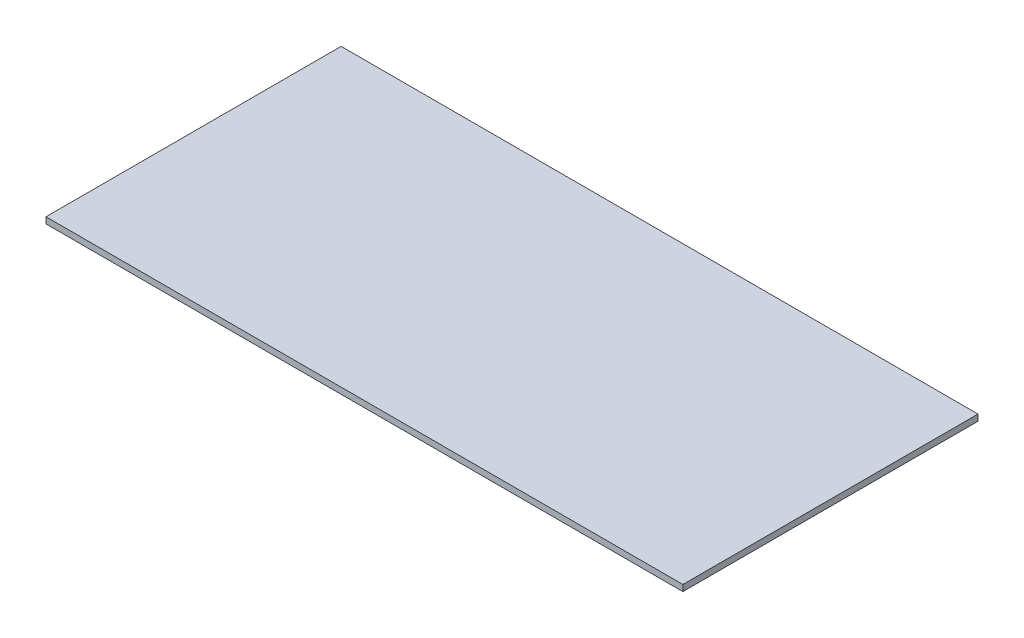
ISO-10303-21;
HEADER;
FILE_DESCRIPTION(('STEP AP214'),'2;1');
FILE_NAME('part.step','',(''),(''),'','','');
FILE_SCHEMA(('AUTOMOTIVE_DESIGN { 1 0 10303 214 1 1 1 1 }'));
ENDSEC;
DATA;
#1=APPLICATION_CONTEXT('core data for automotive mechanical design processes');
#2=APPLICATION_PROTOCOL_DEFINITION('international standard','automotive_design',2000,#1);
#3=PRODUCT_CONTEXT('',#1,'mechanical');
#4=PRODUCT('Part','Part','',(#3));
#5=PRODUCT_RELATED_PRODUCT_CATEGORY('part','',(#4));
#6=PRODUCT_DEFINITION_FORMATION('','',#4);
#7=PRODUCT_DEFINITION_CONTEXT('part definition',#1,'design');
#8=PRODUCT_DEFINITION('design','',#6,#7);
#9=PRODUCT_DEFINITION_SHAPE('','',#8);
#10=(LENGTH_UNIT() NAMED_UNIT(*) SI_UNIT(.MILLI.,.METRE.));
#11=(NAMED_UNIT(*) PLANE_ANGLE_UNIT() SI_UNIT($,.RADIAN.));
#12=(NAMED_UNIT(*) SI_UNIT($,.STERADIAN.) SOLID_ANGLE_UNIT());
#13=UNCERTAINTY_MEASURE_WITH_UNIT(LENGTH_MEASURE(1.E-05),#10,'distance_accuracy_value','');
#14=(GEOMETRIC_REPRESENTATION_CONTEXT(3) GLOBAL_UNCERTAINTY_ASSIGNED_CONTEXT((#13)) GLOBAL_UNIT_ASSIGNED_CONTEXT((#10,
#11,#12)) REPRESENTATION_CONTEXT('',''));
#15=CARTESIAN_POINT('',(0.,0.,0.));
#16=DIRECTION('',(0.,0.,1.));
#17=DIRECTION('',(1.,0.,0.));
#18=AXIS2_PLACEMENT_3D('',#15,#16,#17);
#19=CARTESIAN_POINT('',(205.,4.,-95.));
#20=DIRECTION('',(-1.,0.,0.));
#21=DIRECTION('',(0.,0.,1.));
#22=AXIS2_PLACEMENT_3D('',#19,#20,#21);
#23=PLANE('',#22);
#24=DIRECTION('',(0.,0.,-1.));
#25=VECTOR('',#24,1.);
#26=CARTESIAN_POINT('',(205.,0.,-95.));
#27=LINE('',#26,#25);
#28=CARTESIAN_POINT('',(205.,0.,95.));
#29=VERTEX_POINT('',#28);
#30=CARTESIAN_POINT('',(205.,0.,-95.));
#31=VERTEX_POINT('',#30);
#32=EDGE_CURVE('E108',#29,#31,#27,.T.);
#33=ORIENTED_EDGE('',*,*,#32,.T.);
#34=DIRECTION('',(0.,-1.,0.));
#35=VECTOR('',#34,1.);
#36=CARTESIAN_POINT('',(205.,4.,-95.));
#37=LINE('',#36,#35);
#38=CARTESIAN_POINT('',(205.,4.,-95.));
#39=VERTEX_POINT('',#38);
#40=EDGE_CURVE('E11',#39,#31,#37,.T.);
#41=ORIENTED_EDGE('',*,*,#40,.F.);
#42=DIRECTION('',(0.,0.,-1.));
#43=VECTOR('',#42,1.);
#44=CARTESIAN_POINT('',(205.,4.,-95.));
#45=LINE('',#44,#43);
#46=CARTESIAN_POINT('',(205.,4.,95.));
#47=VERTEX_POINT('',#46);
#48=EDGE_CURVE('E96',#47,#39,#45,.T.);
#49=ORIENTED_EDGE('',*,*,#48,.F.);
#50=DIRECTION('',(0.,-1.,0.));
#51=VECTOR('',#50,1.);
#52=CARTESIAN_POINT('',(205.,4.,95.));
#53=LINE('',#52,#51);
#54=EDGE_CURVE('E104',#47,#29,#53,.T.);
#55=ORIENTED_EDGE('',*,*,#54,.T.);
#56=EDGE_LOOP('',(#33,#41,#49,#55));
#57=FACE_BOUND('',#56,.T.);
#58=ADVANCED_FACE('F45',(#57),#23,.F.);
#59=CARTESIAN_POINT('',(-205.,4.,-95.));
#60=DIRECTION('',(0.,0.,1.));
#61=DIRECTION('',(1.,0.,0.));
#62=AXIS2_PLACEMENT_3D('',#59,#60,#61);
#63=PLANE('',#62);
#64=DIRECTION('',(-1.,0.,0.));
#65=VECTOR('',#64,1.);
#66=CARTESIAN_POINT('',(-205.,0.,-95.));
#67=LINE('',#66,#65);
#68=CARTESIAN_POINT('',(-205.,0.,-95.));
#69=VERTEX_POINT('',#68);
#70=EDGE_CURVE('E100',#31,#69,#67,.T.);
#71=ORIENTED_EDGE('',*,*,#70,.T.);
#72=DIRECTION('',(0.,-1.,0.));
#73=VECTOR('',#72,1.);
#74=CARTESIAN_POINT('',(-205.,4.,-95.));
#75=LINE('',#74,#73);
#76=CARTESIAN_POINT('',(-205.,4.,-95.));
#77=VERTEX_POINT('',#76);
#78=EDGE_CURVE('E53',#77,#69,#75,.T.);
#79=ORIENTED_EDGE('',*,*,#78,.F.);
#80=DIRECTION('',(-1.,0.,0.));
#81=VECTOR('',#80,1.);
#82=CARTESIAN_POINT('',(-205.,4.,-95.));
#83=LINE('',#82,#81);
#84=EDGE_CURVE('E91',#39,#77,#83,.T.);
#85=ORIENTED_EDGE('',*,*,#84,.F.);
#86=ORIENTED_EDGE('',*,*,#40,.T.);
#87=EDGE_LOOP('',(#71,#79,#85,#86));
#88=FACE_BOUND('',#87,.T.);
#89=ADVANCED_FACE('F99',(#88),#63,.F.);
#90=CARTESIAN_POINT('',(-205.,4.,-95.));
#91=DIRECTION('',(1.,0.,0.));
#92=DIRECTION('',(0.,0.,-1.));
#93=AXIS2_PLACEMENT_3D('',#90,#91,#92);
#94=PLANE('',#93);
#95=DIRECTION('',(0.,0.,1.));
#96=VECTOR('',#95,1.);
#97=CARTESIAN_POINT('',(-205.,0.,-95.));
#98=LINE('',#97,#96);
#99=CARTESIAN_POINT('',(-205.,0.,95.));
#100=VERTEX_POINT('',#99);
#101=EDGE_CURVE('E78',#69,#100,#98,.T.);
#102=ORIENTED_EDGE('',*,*,#101,.T.);
#103=DIRECTION('',(0.,-1.,0.));
#104=VECTOR('',#103,1.);
#105=CARTESIAN_POINT('',(-205.,4.,95.));
#106=LINE('',#105,#104);
#107=CARTESIAN_POINT('',(-205.,4.,95.));
#108=VERTEX_POINT('',#107);
#109=EDGE_CURVE('E101',#108,#100,#106,.T.);
#110=ORIENTED_EDGE('',*,*,#109,.F.);
#111=DIRECTION('',(0.,0.,1.));
#112=VECTOR('',#111,1.);
#113=CARTESIAN_POINT('',(-205.,4.,-95.));
#114=LINE('',#113,#112);
#115=EDGE_CURVE('E94',#77,#108,#114,.T.);
#116=ORIENTED_EDGE('',*,*,#115,.F.);
#117=ORIENTED_EDGE('',*,*,#78,.T.);
#118=EDGE_LOOP('',(#102,#110,#116,#117));
#119=FACE_BOUND('',#118,.T.);
#120=ADVANCED_FACE('F102',(#119),#94,.F.);
#121=CARTESIAN_POINT('',(-205.,4.,95.));
#122=DIRECTION('',(0.,0.,-1.));
#123=DIRECTION('',(-1.,0.,0.));
#124=AXIS2_PLACEMENT_3D('',#121,#122,#123);
#125=PLANE('',#124);
#126=DIRECTION('',(1.,0.,0.));
#127=VECTOR('',#126,1.);
#128=CARTESIAN_POINT('',(-205.,0.,95.));
#129=LINE('',#128,#127);
#130=EDGE_CURVE('E84',#100,#29,#129,.T.);
#131=ORIENTED_EDGE('',*,*,#130,.T.);
#132=ORIENTED_EDGE('',*,*,#54,.F.);
#133=DIRECTION('',(1.,0.,0.));
#134=VECTOR('',#133,1.);
#135=CARTESIAN_POINT('',(-205.,4.,95.));
#136=LINE('',#135,#134);
#137=EDGE_CURVE('E61',#108,#47,#136,.T.);
#138=ORIENTED_EDGE('',*,*,#137,.F.);
#139=ORIENTED_EDGE('',*,*,#109,.T.);
#140=EDGE_LOOP('',(#131,#132,#138,#139));
#141=FACE_BOUND('',#140,.T.);
#142=ADVANCED_FACE('F115',(#141),#125,.F.);
#143=CARTESIAN_POINT('',(0.,4.,0.));
#144=DIRECTION('',(0.,1.,0.));
#145=DIRECTION('',(0.,0.,1.));
#146=AXIS2_PLACEMENT_3D('',#143,#144,#145);
#147=PLANE('',#146);
#148=ORIENTED_EDGE('',*,*,#48,.T.);
#149=ORIENTED_EDGE('',*,*,#84,.T.);
#150=ORIENTED_EDGE('',*,*,#115,.T.);
#151=ORIENTED_EDGE('',*,*,#137,.T.);
#152=EDGE_LOOP('',(#148,#149,#150,#151));
#153=FACE_BOUND('',#152,.T.);
#154=ADVANCED_FACE('F92',(#153),#147,.T.);
#155=CARTESIAN_POINT('',(0.,0.,0.));
#156=DIRECTION('',(0.,1.,0.));
#157=DIRECTION('',(0.,0.,1.));
#158=AXIS2_PLACEMENT_3D('',#155,#156,#157);
#159=PLANE('',#158);
#160=ORIENTED_EDGE('',*,*,#32,.F.);
#161=ORIENTED_EDGE('',*,*,#130,.F.);
#162=ORIENTED_EDGE('',*,*,#101,.F.);
#163=ORIENTED_EDGE('',*,*,#70,.F.);
#164=EDGE_LOOP('',(#160,#161,#162,#163));
#165=FACE_BOUND('',#164,.T.);
#166=ADVANCED_FACE('F118',(#165),#159,.F.);
#167=CLOSED_SHELL('',(#58,#89,#120,#142,#154,#166));
#168=MANIFOLD_SOLID_BREP('B2',#167);
#169=ADVANCED_BREP_SHAPE_REPRESENTATION('',(#18,#168),#14);
#170=SHAPE_DEFINITION_REPRESENTATION(#9,#169);
ENDSEC;
END-ISO-10303-21;
